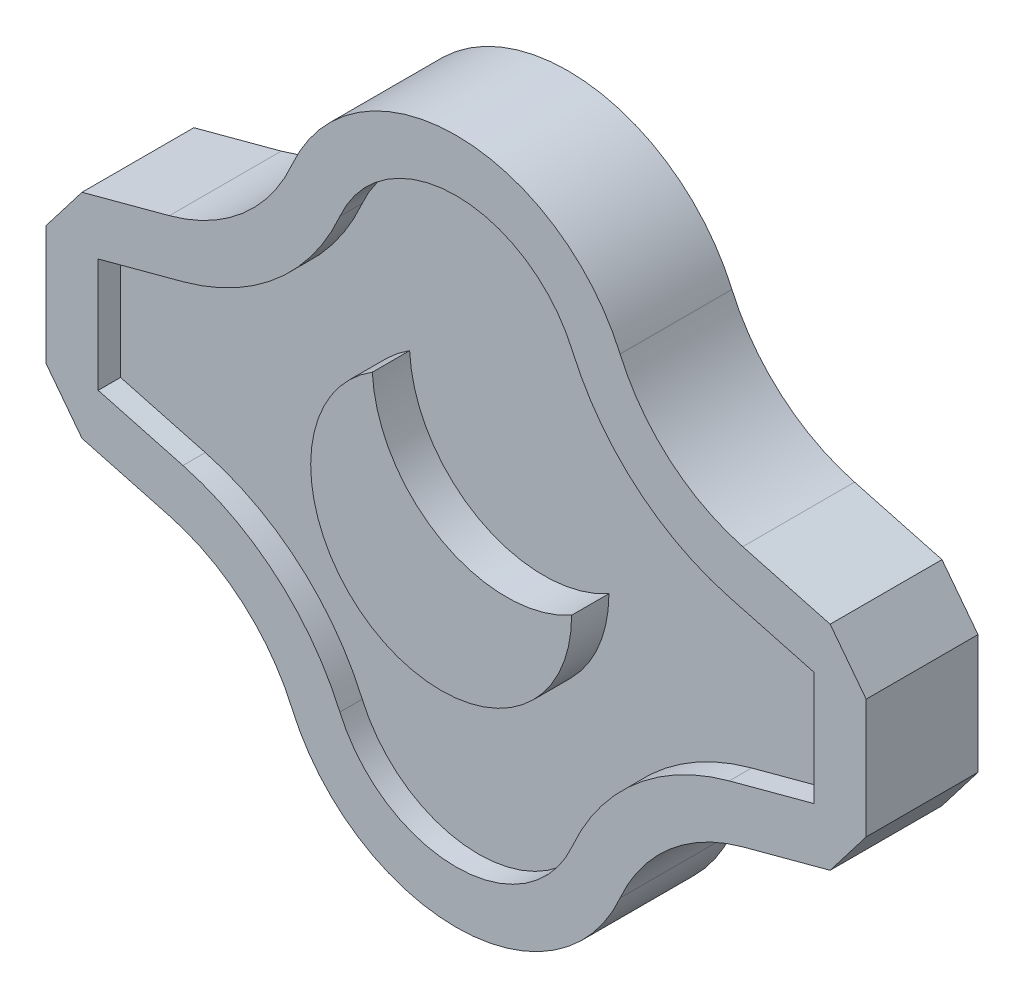
ISO-10303-21;
HEADER;
FILE_DESCRIPTION(('STEP AP214'),'2;1');
FILE_NAME('part.step','',(''),(''),'','','');
FILE_SCHEMA(('AUTOMOTIVE_DESIGN { 1 0 10303 214 1 1 1 1 }'));
ENDSEC;
DATA;
#1=APPLICATION_CONTEXT('core data for automotive mechanical design processes');
#2=APPLICATION_PROTOCOL_DEFINITION('international standard','automotive_design',2000,#1);
#3=PRODUCT_CONTEXT('',#1,'mechanical');
#4=PRODUCT('Part','Part','',(#3));
#5=PRODUCT_RELATED_PRODUCT_CATEGORY('part','',(#4));
#6=PRODUCT_DEFINITION_FORMATION('','',#4);
#7=PRODUCT_DEFINITION_CONTEXT('part definition',#1,'design');
#8=PRODUCT_DEFINITION('design','',#6,#7);
#9=PRODUCT_DEFINITION_SHAPE('','',#8);
#10=(LENGTH_UNIT() NAMED_UNIT(*) SI_UNIT(.MILLI.,.METRE.));
#11=(NAMED_UNIT(*) PLANE_ANGLE_UNIT() SI_UNIT($,.RADIAN.));
#12=(NAMED_UNIT(*) SI_UNIT($,.STERADIAN.) SOLID_ANGLE_UNIT());
#13=UNCERTAINTY_MEASURE_WITH_UNIT(LENGTH_MEASURE(1.E-05),#10,'distance_accuracy_value','');
#14=(GEOMETRIC_REPRESENTATION_CONTEXT(3) GLOBAL_UNCERTAINTY_ASSIGNED_CONTEXT((#13)) GLOBAL_UNIT_ASSIGNED_CONTEXT((#10,
#11,#12)) REPRESENTATION_CONTEXT('',''));
#15=CARTESIAN_POINT('',(0.,0.,0.));
#16=DIRECTION('',(0.,0.,1.));
#17=DIRECTION('',(1.,0.,0.));
#18=AXIS2_PLACEMENT_3D('',#15,#16,#17);
#19=CARTESIAN_POINT('',(44.916297988178,-41.5838243210359,0.));
#20=DIRECTION('',(0.,0.,1.));
#21=DIRECTION('',(1.,0.,0.));
#22=AXIS2_PLACEMENT_3D('',#19,#20,#21);
#23=PLANE('',#22);
#24=DIRECTION('',(0.965925826289068,-0.258819045102521,0.));
#25=VECTOR('',#24,1.);
#26=CARTESIAN_POINT('',(-55.,-13.,0.));
#27=LINE('',#26,#25);
#28=CARTESIAN_POINT('',(-50.1703708685546,-14.2940952255126,0.));
#29=VERTEX_POINT('',#28);
#30=CARTESIAN_POINT('',(-38.445821860615,-17.4356786638092,0.));
#31=VERTEX_POINT('',#30);
#32=EDGE_CURVE('E437',#29,#31,#27,.T.);
#33=ORIENTED_EDGE('',*,*,#32,.F.);
#34=DIRECTION('',(-0.608761429008719,0.793353340291236,0.));
#35=VECTOR('',#34,1.);
#36=CARTESIAN_POINT('',(-50.1703708685546,-14.2940952255126,0.));
#37=LINE('',#36,#35);
#38=CARTESIAN_POINT('',(-55.,-7.99999999999994,0.));
#39=VERTEX_POINT('',#38);
#40=EDGE_CURVE('E486',#29,#39,#37,.T.);
#41=ORIENTED_EDGE('',*,*,#40,.T.);
#42=DIRECTION('',(0.,1.,0.));
#43=VECTOR('',#42,1.);
#44=CARTESIAN_POINT('',(-55.,-13.,0.));
#45=LINE('',#44,#43);
#46=CARTESIAN_POINT('',(-55.,7.99999999999994,0.));
#47=VERTEX_POINT('',#46);
#48=EDGE_CURVE('E439',#39,#47,#45,.T.);
#49=ORIENTED_EDGE('',*,*,#48,.T.);
#50=DIRECTION('',(-0.60876142900872,-0.793353340291235,0.));
#51=VECTOR('',#50,1.);
#52=CARTESIAN_POINT('',(-55.,7.99999999999995,0.));
#53=LINE('',#52,#51);
#54=CARTESIAN_POINT('',(-50.1703708685546,14.2940952255126,0.));
#55=VERTEX_POINT('',#54);
#56=EDGE_CURVE('E484',#47,#55,#53,.F.);
#57=ORIENTED_EDGE('',*,*,#56,.T.);
#58=DIRECTION('',(0.965925826289068,0.258819045102521,0.));
#59=VECTOR('',#58,1.);
#60=CARTESIAN_POINT('',(-55.,13.,0.));
#61=LINE('',#60,#59);
#62=CARTESIAN_POINT('',(-38.445821860615,17.4356786638092,0.));
#63=VERTEX_POINT('',#62);
#64=EDGE_CURVE('E442',#55,#63,#61,.T.);
#65=ORIENTED_EDGE('',*,*,#64,.T.);
#66=CARTESIAN_POINT('',(-44.916297988178,41.5838243210359,0.));
#67=DIRECTION('',(0.,0.,1.));
#68=DIRECTION('',(1.,0.,0.));
#69=AXIS2_PLACEMENT_3D('',#66,#67,#68);
#70=CIRCLE('',#69,25.);
#71=CARTESIAN_POINT('',(-21.9998194227811,31.5920772184665,0.));
#72=VERTEX_POINT('',#71);
#73=EDGE_CURVE('E444',#63,#72,#70,.T.);
#74=ORIENTED_EDGE('',*,*,#73,.T.);
#75=CARTESIAN_POINT('',(0.,22.,0.));
#76=DIRECTION('',(0.,0.,-1.));
#77=DIRECTION('',(-1.,0.,0.));
#78=AXIS2_PLACEMENT_3D('',#75,#76,#77);
#79=CIRCLE('',#78,24.);
#80=CARTESIAN_POINT('',(21.9998194227811,31.5920772184665,0.));
#81=VERTEX_POINT('',#80);
#82=EDGE_CURVE('E447',#72,#81,#79,.T.);
#83=ORIENTED_EDGE('',*,*,#82,.T.);
#84=CARTESIAN_POINT('',(44.916297988178,41.5838243210359,0.));
#85=DIRECTION('',(0.,0.,-1.));
#86=DIRECTION('',(-1.,0.,0.));
#87=AXIS2_PLACEMENT_3D('',#84,#85,#86);
#88=CIRCLE('',#87,25.);
#89=CARTESIAN_POINT('',(38.445821860615,17.4356786638092,0.));
#90=VERTEX_POINT('',#89);
#91=EDGE_CURVE('E450',#90,#81,#88,.T.);
#92=ORIENTED_EDGE('',*,*,#91,.F.);
#93=DIRECTION('',(-0.965925826289068,0.258819045102521,0.));
#94=VECTOR('',#93,1.);
#95=CARTESIAN_POINT('',(55.,13.,0.));
#96=LINE('',#95,#94);
#97=CARTESIAN_POINT('',(50.1703708685546,14.2940952255126,0.));
#98=VERTEX_POINT('',#97);
#99=EDGE_CURVE('E453',#98,#90,#96,.T.);
#100=ORIENTED_EDGE('',*,*,#99,.F.);
#101=DIRECTION('',(-0.60876142900872,0.793353340291236,0.));
#102=VECTOR('',#101,1.);
#103=CARTESIAN_POINT('',(50.1703708685546,14.2940952255126,0.));
#104=LINE('',#103,#102);
#105=CARTESIAN_POINT('',(55.,7.99999999999994,0.));
#106=VERTEX_POINT('',#105);
#107=EDGE_CURVE('E480',#98,#106,#104,.F.);
#108=ORIENTED_EDGE('',*,*,#107,.T.);
#109=DIRECTION('',(0.,1.,0.));
#110=VECTOR('',#109,1.);
#111=CARTESIAN_POINT('',(55.,-13.,0.));
#112=LINE('',#111,#110);
#113=CARTESIAN_POINT('',(55.,-7.99999999999995,0.));
#114=VERTEX_POINT('',#113);
#115=EDGE_CURVE('E401',#114,#106,#112,.T.);
#116=ORIENTED_EDGE('',*,*,#115,.F.);
#117=DIRECTION('',(-0.60876142900872,-0.793353340291235,0.));
#118=VECTOR('',#117,1.);
#119=CARTESIAN_POINT('',(55.,-7.99999999999994,0.));
#120=LINE('',#119,#118);
#121=CARTESIAN_POINT('',(50.1703708685546,-14.2940952255126,0.));
#122=VERTEX_POINT('',#121);
#123=EDGE_CURVE('E482',#114,#122,#120,.T.);
#124=ORIENTED_EDGE('',*,*,#123,.T.);
#125=DIRECTION('',(-0.965925826289068,-0.258819045102521,0.));
#126=VECTOR('',#125,1.);
#127=CARTESIAN_POINT('',(55.,-13.,0.));
#128=LINE('',#127,#126);
#129=CARTESIAN_POINT('',(38.445821860615,-17.4356786638092,0.));
#130=VERTEX_POINT('',#129);
#131=EDGE_CURVE('E375',#122,#130,#128,.T.);
#132=ORIENTED_EDGE('',*,*,#131,.T.);
#133=CARTESIAN_POINT('',(44.916297988178,-41.5838243210359,0.));
#134=DIRECTION('',(0.,0.,1.));
#135=DIRECTION('',(1.,0.,0.));
#136=AXIS2_PLACEMENT_3D('',#133,#134,#135);
#137=CIRCLE('',#136,25.);
#138=CARTESIAN_POINT('',(21.9998194227811,-31.5920772184666,0.));
#139=VERTEX_POINT('',#138);
#140=EDGE_CURVE('E429',#130,#139,#137,.T.);
#141=ORIENTED_EDGE('',*,*,#140,.T.);
#142=CARTESIAN_POINT('',(0.,-22.,0.));
#143=DIRECTION('',(0.,0.,1.));
#144=DIRECTION('',(1.,0.,0.));
#145=AXIS2_PLACEMENT_3D('',#142,#143,#144);
#146=CIRCLE('',#145,24.);
#147=CARTESIAN_POINT('',(-21.9998194227811,-31.5920772184665,0.));
#148=VERTEX_POINT('',#147);
#149=EDGE_CURVE('E432',#148,#139,#146,.T.);
#150=ORIENTED_EDGE('',*,*,#149,.F.);
#151=CARTESIAN_POINT('',(-44.916297988178,-41.5838243210359,0.));
#152=DIRECTION('',(0.,0.,-1.));
#153=DIRECTION('',(-1.,0.,0.));
#154=AXIS2_PLACEMENT_3D('',#151,#152,#153);
#155=CIRCLE('',#154,25.);
#156=EDGE_CURVE('E435',#31,#148,#155,.T.);
#157=ORIENTED_EDGE('',*,*,#156,.F.);
#158=EDGE_LOOP('',(#33,#41,#49,#57,#65,#74,#83,#92,#100,#108,#116,#124,#132,#141,#150,#157));
#159=FACE_BOUND('',#158,.T.);
#160=CARTESIAN_POINT('',(8.75000000000001,15.7301462167394,0.));
#161=DIRECTION('',(0.,0.,-1.));
#162=DIRECTION('',(-1.,0.,0.));
#163=AXIS2_PLACEMENT_3D('',#160,#161,#162);
#164=CIRCLE('',#163,18.);
#165=CARTESIAN_POINT('',(17.5,0.,0.));
#166=VERTEX_POINT('',#165);
#167=CARTESIAN_POINT('',(-9.22935956790123,14.8683866631989,0.));
#168=VERTEX_POINT('',#167);
#169=EDGE_CURVE('E266',#166,#168,#164,.T.);
#170=ORIENTED_EDGE('',*,*,#169,.T.);
#171=CARTESIAN_POINT('',(0.,0.,0.));
#172=DIRECTION('',(0.,0.,-1.));
#173=DIRECTION('',(-1.,0.,0.));
#174=AXIS2_PLACEMENT_3D('',#171,#172,#173);
#175=CIRCLE('',#174,17.5);
#176=EDGE_CURVE('E277',#166,#168,#175,.T.);
#177=ORIENTED_EDGE('',*,*,#176,.F.);
#178=EDGE_LOOP('',(#170,#177));
#179=FACE_BOUND('',#178,.T.);
#180=ADVANCED_FACE('F49',(#159,#179),#23,.F.);
#181=CARTESIAN_POINT('',(44.916297988178,-41.5838243210359,12.));
#182=DIRECTION('',(0.,0.,1.));
#183=DIRECTION('',(1.,0.,0.));
#184=AXIS2_PLACEMENT_3D('',#181,#182,#183);
#185=PLANE('',#184);
#186=CARTESIAN_POINT('',(44.916297988178,-41.5838243210359,12.));
#187=DIRECTION('',(0.,0.,-1.));
#188=DIRECTION('',(1.,0.,0.));
#189=AXIS2_PLACEMENT_3D('',#186,#187,#188);
#190=CIRCLE('',#189,32.);
#191=CARTESIAN_POINT('',(15.5832054244699,-28.7943880297471,12.));
#192=VERTEX_POINT('',#191);
#193=CARTESIAN_POINT('',(36.6340885448973,-10.6741978797857,12.));
#194=VERTEX_POINT('',#193);
#195=EDGE_CURVE('E302',#192,#194,#190,.T.);
#196=ORIENTED_EDGE('',*,*,#195,.T.);
#197=DIRECTION('',(0.965925826289068,0.258819045102521,0.));
#198=VECTOR('',#197,1.);
#199=CARTESIAN_POINT('',(36.6340885448973,-10.6741978797857,12.));
#200=LINE('',#199,#198);
#201=CARTESIAN_POINT('',(48.,-7.62871108414727,12.));
#202=VERTEX_POINT('',#201);
#203=EDGE_CURVE('E305',#194,#202,#200,.T.);
#204=ORIENTED_EDGE('',*,*,#203,.T.);
#205=DIRECTION('',(0.,1.,0.));
#206=VECTOR('',#205,1.);
#207=CARTESIAN_POINT('',(48.,-7.62871108414727,12.));
#208=LINE('',#207,#206);
#209=CARTESIAN_POINT('',(48.,7.62871108414727,12.));
#210=VERTEX_POINT('',#209);
#211=EDGE_CURVE('E309',#202,#210,#208,.T.);
#212=ORIENTED_EDGE('',*,*,#211,.T.);
#213=DIRECTION('',(-0.965925826289068,0.258819045102521,0.));
#214=VECTOR('',#213,1.);
#215=CARTESIAN_POINT('',(48.,7.62871108414727,12.));
#216=LINE('',#215,#214);
#217=CARTESIAN_POINT('',(36.6340885448973,10.6741978797857,12.));
#218=VERTEX_POINT('',#217);
#219=EDGE_CURVE('E312',#210,#218,#216,.T.);
#220=ORIENTED_EDGE('',*,*,#219,.T.);
#221=CARTESIAN_POINT('',(44.916297988178,41.5838243210359,12.));
#222=DIRECTION('',(0.,0.,-1.));
#223=DIRECTION('',(1.,0.,0.));
#224=AXIS2_PLACEMENT_3D('',#221,#222,#223);
#225=CIRCLE('',#224,32.);
#226=CARTESIAN_POINT('',(15.5832054244699,28.7943880297471,12.));
#227=VERTEX_POINT('',#226);
#228=EDGE_CURVE('E315',#218,#227,#225,.T.);
#229=ORIENTED_EDGE('',*,*,#228,.T.);
#230=CARTESIAN_POINT('',(0.,22.,12.));
#231=DIRECTION('',(0.,0.,1.));
#232=DIRECTION('',(1.,0.,0.));
#233=AXIS2_PLACEMENT_3D('',#230,#231,#232);
#234=CIRCLE('',#233,17.);
#235=CARTESIAN_POINT('',(-15.5832054244699,28.7943880297471,12.));
#236=VERTEX_POINT('',#235);
#237=EDGE_CURVE('E318',#227,#236,#234,.T.);
#238=ORIENTED_EDGE('',*,*,#237,.T.);
#239=CARTESIAN_POINT('',(-44.916297988178,41.5838243210359,12.));
#240=DIRECTION('',(0.,0.,-1.));
#241=DIRECTION('',(1.,0.,0.));
#242=AXIS2_PLACEMENT_3D('',#239,#240,#241);
#243=CIRCLE('',#242,32.);
#244=CARTESIAN_POINT('',(-36.6340885448973,10.6741978797857,12.));
#245=VERTEX_POINT('',#244);
#246=EDGE_CURVE('E321',#236,#245,#243,.T.);
#247=ORIENTED_EDGE('',*,*,#246,.T.);
#248=DIRECTION('',(-0.965925826289068,-0.258819045102522,0.));
#249=VECTOR('',#248,1.);
#250=CARTESIAN_POINT('',(-36.6340885448973,10.6741978797857,12.));
#251=LINE('',#250,#249);
#252=CARTESIAN_POINT('',(-48.,7.62871108414727,12.));
#253=VERTEX_POINT('',#252);
#254=EDGE_CURVE('E324',#245,#253,#251,.T.);
#255=ORIENTED_EDGE('',*,*,#254,.T.);
#256=DIRECTION('',(0.,-1.,0.));
#257=VECTOR('',#256,1.);
#258=CARTESIAN_POINT('',(-48.,7.62871108414727,12.));
#259=LINE('',#258,#257);
#260=CARTESIAN_POINT('',(-48.,-7.62871108414727,12.));
#261=VERTEX_POINT('',#260);
#262=EDGE_CURVE('E327',#253,#261,#259,.T.);
#263=ORIENTED_EDGE('',*,*,#262,.T.);
#264=DIRECTION('',(0.965925826289068,-0.258819045102521,0.));
#265=VECTOR('',#264,1.);
#266=CARTESIAN_POINT('',(-48.,-7.62871108414727,12.));
#267=LINE('',#266,#265);
#268=CARTESIAN_POINT('',(-36.6340885448973,-10.6741978797857,12.));
#269=VERTEX_POINT('',#268);
#270=EDGE_CURVE('E330',#261,#269,#267,.T.);
#271=ORIENTED_EDGE('',*,*,#270,.T.);
#272=CARTESIAN_POINT('',(-44.916297988178,-41.5838243210359,12.));
#273=DIRECTION('',(0.,0.,-1.));
#274=DIRECTION('',(1.,0.,0.));
#275=AXIS2_PLACEMENT_3D('',#272,#273,#274);
#276=CIRCLE('',#275,32.);
#277=CARTESIAN_POINT('',(-15.5832054244699,-28.7943880297471,12.));
#278=VERTEX_POINT('',#277);
#279=EDGE_CURVE('E333',#269,#278,#276,.T.);
#280=ORIENTED_EDGE('',*,*,#279,.T.);
#281=CARTESIAN_POINT('',(0.,-22.,12.));
#282=DIRECTION('',(0.,0.,1.));
#283=DIRECTION('',(1.,0.,0.));
#284=AXIS2_PLACEMENT_3D('',#281,#282,#283);
#285=CIRCLE('',#284,17.);
#286=EDGE_CURVE('E336',#278,#192,#285,.T.);
#287=ORIENTED_EDGE('',*,*,#286,.T.);
#288=EDGE_LOOP('',(#196,#204,#212,#220,#229,#238,#247,#255,#263,#271,#280,#287));
#289=FACE_BOUND('',#288,.T.);
#290=CARTESIAN_POINT('',(8.75000000000001,15.7301462167394,12.));
#291=DIRECTION('',(0.,0.,1.));
#292=DIRECTION('',(1.,0.,0.));
#293=AXIS2_PLACEMENT_3D('',#290,#291,#292);
#294=CIRCLE('',#293,18.);
#295=CARTESIAN_POINT('',(-9.22935956790123,14.8683866631989,12.));
#296=VERTEX_POINT('',#295);
#297=CARTESIAN_POINT('',(17.5,0.,12.));
#298=VERTEX_POINT('',#297);
#299=EDGE_CURVE('E284',#296,#298,#294,.T.);
#300=ORIENTED_EDGE('',*,*,#299,.T.);
#301=CARTESIAN_POINT('',(0.,0.,12.));
#302=DIRECTION('',(0.,0.,1.));
#303=DIRECTION('',(1.,0.,0.));
#304=AXIS2_PLACEMENT_3D('',#301,#302,#303);
#305=CIRCLE('',#304,17.5);
#306=EDGE_CURVE('E290',#296,#298,#305,.T.);
#307=ORIENTED_EDGE('',*,*,#306,.F.);
#308=EDGE_LOOP('',(#300,#307));
#309=FACE_BOUND('',#308,.T.);
#310=ADVANCED_FACE('F588',(#289,#309),#185,.T.);
#311=CARTESIAN_POINT('',(55.,-13.,15.));
#312=DIRECTION('',(0.258819045102521,-0.965925826289068,0.));
#313=DIRECTION('',(0.965925826289068,0.258819045102521,0.));
#314=AXIS2_PLACEMENT_3D('',#311,#312,#313);
#315=PLANE('',#314);
#316=ORIENTED_EDGE('',*,*,#131,.F.);
#317=DIRECTION('',(0.,0.,1.));
#318=VECTOR('',#317,1.);
#319=CARTESIAN_POINT('',(50.1703708685546,-14.2940952255126,15.));
#320=LINE('',#319,#318);
#321=CARTESIAN_POINT('',(50.1703708685546,-14.2940952255126,15.));
#322=VERTEX_POINT('',#321);
#323=EDGE_CURVE('E58',#122,#322,#320,.T.);
#324=ORIENTED_EDGE('',*,*,#323,.T.);
#325=DIRECTION('',(-0.965925826289068,-0.258819045102521,0.));
#326=VECTOR('',#325,1.);
#327=CARTESIAN_POINT('',(55.,-13.,15.));
#328=LINE('',#327,#326);
#329=CARTESIAN_POINT('',(38.445821860615,-17.4356786638092,15.));
#330=VERTEX_POINT('',#329);
#331=EDGE_CURVE('E398',#322,#330,#328,.T.);
#332=ORIENTED_EDGE('',*,*,#331,.T.);
#333=DIRECTION('',(0.,0.,-1.));
#334=VECTOR('',#333,1.);
#335=CARTESIAN_POINT('',(38.445821860615,-17.4356786638092,15.));
#336=LINE('',#335,#334);
#337=EDGE_CURVE('E427',#330,#130,#336,.T.);
#338=ORIENTED_EDGE('',*,*,#337,.T.);
#339=EDGE_LOOP('',(#316,#324,#332,#338));
#340=FACE_BOUND('',#339,.T.);
#341=ADVANCED_FACE('F509',(#340),#315,.T.);
#342=CARTESIAN_POINT('',(55.,-13.,15.));
#343=DIRECTION('',(-1.,0.,0.));
#344=DIRECTION('',(0.,0.,1.));
#345=AXIS2_PLACEMENT_3D('',#342,#343,#344);
#346=PLANE('',#345);
#347=DIRECTION('',(0.,1.,0.));
#348=VECTOR('',#347,1.);
#349=CARTESIAN_POINT('',(55.,-13.,15.));
#350=LINE('',#349,#348);
#351=CARTESIAN_POINT('',(55.,-7.99999999999995,15.));
#352=VERTEX_POINT('',#351);
#353=CARTESIAN_POINT('',(55.,7.99999999999994,15.));
#354=VERTEX_POINT('',#353);
#355=EDGE_CURVE('E425',#352,#354,#350,.T.);
#356=ORIENTED_EDGE('',*,*,#355,.F.);
#357=DIRECTION('',(0.,0.,-1.));
#358=VECTOR('',#357,1.);
#359=CARTESIAN_POINT('',(55.,-7.99999999999994,0.));
#360=LINE('',#359,#358);
#361=EDGE_CURVE('E503',#352,#114,#360,.T.);
#362=ORIENTED_EDGE('',*,*,#361,.T.);
#363=ORIENTED_EDGE('',*,*,#115,.T.);
#364=DIRECTION('',(0.,0.,1.));
#365=VECTOR('',#364,1.);
#366=CARTESIAN_POINT('',(55.,7.99999999999995,15.));
#367=LINE('',#366,#365);
#368=EDGE_CURVE('E501',#106,#354,#367,.T.);
#369=ORIENTED_EDGE('',*,*,#368,.T.);
#370=EDGE_LOOP('',(#356,#362,#363,#369));
#371=FACE_BOUND('',#370,.T.);
#372=ADVANCED_FACE('F521',(#371),#346,.F.);
#373=CARTESIAN_POINT('',(55.,13.,15.));
#374=DIRECTION('',(-0.258819045102521,-0.965925826289068,0.));
#375=DIRECTION('',(0.965925826289068,-0.258819045102521,0.));
#376=AXIS2_PLACEMENT_3D('',#373,#374,#375);
#377=PLANE('',#376);
#378=DIRECTION('',(-0.965925826289068,0.258819045102521,0.));
#379=VECTOR('',#378,1.);
#380=CARTESIAN_POINT('',(55.,13.,15.));
#381=LINE('',#380,#379);
#382=CARTESIAN_POINT('',(50.1703708685546,14.2940952255126,15.));
#383=VERTEX_POINT('',#382);
#384=CARTESIAN_POINT('',(38.445821860615,17.4356786638092,15.));
#385=VERTEX_POINT('',#384);
#386=EDGE_CURVE('E423',#383,#385,#381,.T.);
#387=ORIENTED_EDGE('',*,*,#386,.F.);
#388=DIRECTION('',(0.,0.,-1.));
#389=VECTOR('',#388,1.);
#390=CARTESIAN_POINT('',(50.1703708685546,14.2940952255126,15.));
#391=LINE('',#390,#389);
#392=EDGE_CURVE('E11',#383,#98,#391,.T.);
#393=ORIENTED_EDGE('',*,*,#392,.T.);
#394=ORIENTED_EDGE('',*,*,#99,.T.);
#395=DIRECTION('',(0.,0.,-1.));
#396=VECTOR('',#395,1.);
#397=CARTESIAN_POINT('',(38.445821860615,17.4356786638092,15.));
#398=LINE('',#397,#396);
#399=EDGE_CURVE('E457',#385,#90,#398,.T.);
#400=ORIENTED_EDGE('',*,*,#399,.F.);
#401=EDGE_LOOP('',(#387,#393,#394,#400));
#402=FACE_BOUND('',#401,.T.);
#403=ADVANCED_FACE('F531',(#402),#377,.F.);
#404=CARTESIAN_POINT('',(44.916297988178,41.5838243210359,15.));
#405=DIRECTION('',(0.,0.,-1.));
#406=DIRECTION('',(-1.,0.,0.));
#407=AXIS2_PLACEMENT_3D('',#404,#405,#406);
#408=CYLINDRICAL_SURFACE('',#407,25.);
#409=ORIENTED_EDGE('',*,*,#91,.T.);
#410=DIRECTION('',(0.,0.,-1.));
#411=VECTOR('',#410,1.);
#412=CARTESIAN_POINT('',(21.9998194227811,31.5920772184665,15.));
#413=LINE('',#412,#411);
#414=CARTESIAN_POINT('',(21.9998194227811,31.5920772184665,15.));
#415=VERTEX_POINT('',#414);
#416=EDGE_CURVE('E461',#415,#81,#413,.T.);
#417=ORIENTED_EDGE('',*,*,#416,.F.);
#418=CARTESIAN_POINT('',(44.916297988178,41.5838243210359,15.));
#419=DIRECTION('',(0.,0.,-1.));
#420=DIRECTION('',(-1.,0.,0.));
#421=AXIS2_PLACEMENT_3D('',#418,#419,#420);
#422=CIRCLE('',#421,25.);
#423=EDGE_CURVE('E421',#385,#415,#422,.T.);
#424=ORIENTED_EDGE('',*,*,#423,.F.);
#425=ORIENTED_EDGE('',*,*,#399,.T.);
#426=EDGE_LOOP('',(#409,#417,#424,#425));
#427=FACE_BOUND('',#426,.T.);
#428=ADVANCED_FACE('F538',(#427),#408,.F.);
#429=CARTESIAN_POINT('',(0.,22.,15.));
#430=DIRECTION('',(0.,0.,-1.));
#431=DIRECTION('',(-1.,0.,0.));
#432=AXIS2_PLACEMENT_3D('',#429,#430,#431);
#433=CYLINDRICAL_SURFACE('',#432,24.);
#434=ORIENTED_EDGE('',*,*,#82,.F.);
#435=DIRECTION('',(0.,0.,-1.));
#436=VECTOR('',#435,1.);
#437=CARTESIAN_POINT('',(-21.9998194227811,31.5920772184665,15.));
#438=LINE('',#437,#436);
#439=CARTESIAN_POINT('',(-21.9998194227811,31.5920772184665,15.));
#440=VERTEX_POINT('',#439);
#441=EDGE_CURVE('E463',#440,#72,#438,.T.);
#442=ORIENTED_EDGE('',*,*,#441,.F.);
#443=CARTESIAN_POINT('',(0.,22.,15.));
#444=DIRECTION('',(0.,0.,-1.));
#445=DIRECTION('',(-1.,0.,0.));
#446=AXIS2_PLACEMENT_3D('',#443,#444,#445);
#447=CIRCLE('',#446,24.);
#448=EDGE_CURVE('E418',#440,#415,#447,.T.);
#449=ORIENTED_EDGE('',*,*,#448,.T.);
#450=ORIENTED_EDGE('',*,*,#416,.T.);
#451=EDGE_LOOP('',(#434,#442,#449,#450));
#452=FACE_BOUND('',#451,.T.);
#453=ADVANCED_FACE('F541',(#452),#433,.T.);
#454=CARTESIAN_POINT('',(-44.916297988178,41.5838243210359,15.));
#455=DIRECTION('',(0.,0.,-1.));
#456=DIRECTION('',(-1.,0.,0.));
#457=AXIS2_PLACEMENT_3D('',#454,#455,#456);
#458=CYLINDRICAL_SURFACE('',#457,25.);
#459=ORIENTED_EDGE('',*,*,#73,.F.);
#460=DIRECTION('',(0.,0.,-1.));
#461=VECTOR('',#460,1.);
#462=CARTESIAN_POINT('',(-38.445821860615,17.4356786638092,15.));
#463=LINE('',#462,#461);
#464=CARTESIAN_POINT('',(-38.445821860615,17.4356786638092,15.));
#465=VERTEX_POINT('',#464);
#466=EDGE_CURVE('E465',#465,#63,#463,.T.);
#467=ORIENTED_EDGE('',*,*,#466,.F.);
#468=CARTESIAN_POINT('',(-44.916297988178,41.5838243210359,15.));
#469=DIRECTION('',(0.,0.,1.));
#470=DIRECTION('',(1.,0.,0.));
#471=AXIS2_PLACEMENT_3D('',#468,#469,#470);
#472=CIRCLE('',#471,25.);
#473=EDGE_CURVE('E415',#465,#440,#472,.T.);
#474=ORIENTED_EDGE('',*,*,#473,.T.);
#475=ORIENTED_EDGE('',*,*,#441,.T.);
#476=EDGE_LOOP('',(#459,#467,#474,#475));
#477=FACE_BOUND('',#476,.T.);
#478=ADVANCED_FACE('F544',(#477),#458,.F.);
#479=CARTESIAN_POINT('',(-55.,13.,15.));
#480=DIRECTION('',(-0.258819045102521,0.965925826289068,0.));
#481=DIRECTION('',(-0.965925826289068,-0.258819045102521,0.));
#482=AXIS2_PLACEMENT_3D('',#479,#480,#481);
#483=PLANE('',#482);
#484=ORIENTED_EDGE('',*,*,#64,.F.);
#485=DIRECTION('',(0.,0.,1.));
#486=VECTOR('',#485,1.);
#487=CARTESIAN_POINT('',(-50.1703708685546,14.2940952255126,15.));
#488=LINE('',#487,#486);
#489=CARTESIAN_POINT('',(-50.1703708685546,14.2940952255126,15.));
#490=VERTEX_POINT('',#489);
#491=EDGE_CURVE('E65',#55,#490,#488,.T.);
#492=ORIENTED_EDGE('',*,*,#491,.T.);
#493=DIRECTION('',(0.965925826289068,0.258819045102521,0.));
#494=VECTOR('',#493,1.);
#495=CARTESIAN_POINT('',(-55.,13.,15.));
#496=LINE('',#495,#494);
#497=EDGE_CURVE('E413',#490,#465,#496,.T.);
#498=ORIENTED_EDGE('',*,*,#497,.T.);
#499=ORIENTED_EDGE('',*,*,#466,.T.);
#500=EDGE_LOOP('',(#484,#492,#498,#499));
#501=FACE_BOUND('',#500,.T.);
#502=ADVANCED_FACE('F609',(#501),#483,.T.);
#503=CARTESIAN_POINT('',(-55.,-13.,15.));
#504=DIRECTION('',(-1.,0.,0.));
#505=DIRECTION('',(0.,0.,1.));
#506=AXIS2_PLACEMENT_3D('',#503,#504,#505);
#507=PLANE('',#506);
#508=ORIENTED_EDGE('',*,*,#48,.F.);
#509=DIRECTION('',(0.,0.,1.));
#510=VECTOR('',#509,1.);
#511=CARTESIAN_POINT('',(-55.,-7.99999999999994,15.));
#512=LINE('',#511,#510);
#513=CARTESIAN_POINT('',(-55.,-7.99999999999994,15.));
#514=VERTEX_POINT('',#513);
#515=EDGE_CURVE('E491',#39,#514,#512,.T.);
#516=ORIENTED_EDGE('',*,*,#515,.T.);
#517=DIRECTION('',(0.,1.,0.));
#518=VECTOR('',#517,1.);
#519=CARTESIAN_POINT('',(-55.,-13.,15.));
#520=LINE('',#519,#518);
#521=CARTESIAN_POINT('',(-55.,7.99999999999994,15.));
#522=VERTEX_POINT('',#521);
#523=EDGE_CURVE('E410',#514,#522,#520,.T.);
#524=ORIENTED_EDGE('',*,*,#523,.T.);
#525=DIRECTION('',(0.,0.,-1.));
#526=VECTOR('',#525,1.);
#527=CARTESIAN_POINT('',(-55.,7.99999999999995,15.));
#528=LINE('',#527,#526);
#529=EDGE_CURVE('E488',#522,#47,#528,.T.);
#530=ORIENTED_EDGE('',*,*,#529,.T.);
#531=EDGE_LOOP('',(#508,#516,#524,#530));
#532=FACE_BOUND('',#531,.T.);
#533=ADVANCED_FACE('F552',(#532),#507,.T.);
#534=CARTESIAN_POINT('',(-55.,-13.,15.));
#535=DIRECTION('',(0.258819045102521,0.965925826289068,0.));
#536=DIRECTION('',(-0.965925826289068,0.258819045102521,0.));
#537=AXIS2_PLACEMENT_3D('',#534,#535,#536);
#538=PLANE('',#537);
#539=DIRECTION('',(0.965925826289068,-0.258819045102521,0.));
#540=VECTOR('',#539,1.);
#541=CARTESIAN_POINT('',(-55.,-13.,15.));
#542=LINE('',#541,#540);
#543=CARTESIAN_POINT('',(-50.1703708685546,-14.2940952255126,15.));
#544=VERTEX_POINT('',#543);
#545=CARTESIAN_POINT('',(-38.445821860615,-17.4356786638092,15.));
#546=VERTEX_POINT('',#545);
#547=EDGE_CURVE('E408',#544,#546,#542,.T.);
#548=ORIENTED_EDGE('',*,*,#547,.F.);
#549=DIRECTION('',(0.,0.,-1.));
#550=VECTOR('',#549,1.);
#551=CARTESIAN_POINT('',(-50.1703708685546,-14.2940952255126,0.));
#552=LINE('',#551,#550);
#553=EDGE_CURVE('E460',#544,#29,#552,.T.);
#554=ORIENTED_EDGE('',*,*,#553,.T.);
#555=ORIENTED_EDGE('',*,*,#32,.T.);
#556=DIRECTION('',(0.,0.,-1.));
#557=VECTOR('',#556,1.);
#558=CARTESIAN_POINT('',(-38.445821860615,-17.4356786638092,15.));
#559=LINE('',#558,#557);
#560=EDGE_CURVE('E468',#546,#31,#559,.T.);
#561=ORIENTED_EDGE('',*,*,#560,.F.);
#562=EDGE_LOOP('',(#548,#554,#555,#561));
#563=FACE_BOUND('',#562,.T.);
#564=ADVANCED_FACE('F561',(#563),#538,.F.);
#565=CARTESIAN_POINT('',(-44.916297988178,-41.5838243210359,15.));
#566=DIRECTION('',(0.,0.,-1.));
#567=DIRECTION('',(-1.,0.,0.));
#568=AXIS2_PLACEMENT_3D('',#565,#566,#567);
#569=CYLINDRICAL_SURFACE('',#568,25.);
#570=ORIENTED_EDGE('',*,*,#156,.T.);
#571=DIRECTION('',(0.,0.,-1.));
#572=VECTOR('',#571,1.);
#573=CARTESIAN_POINT('',(-21.9998194227811,-31.5920772184665,15.));
#574=LINE('',#573,#572);
#575=CARTESIAN_POINT('',(-21.9998194227811,-31.5920772184665,15.));
#576=VERTEX_POINT('',#575);
#577=EDGE_CURVE('E471',#576,#148,#574,.T.);
#578=ORIENTED_EDGE('',*,*,#577,.F.);
#579=CARTESIAN_POINT('',(-44.916297988178,-41.5838243210359,15.));
#580=DIRECTION('',(0.,0.,-1.));
#581=DIRECTION('',(-1.,0.,0.));
#582=AXIS2_PLACEMENT_3D('',#579,#580,#581);
#583=CIRCLE('',#582,25.);
#584=EDGE_CURVE('E406',#546,#576,#583,.T.);
#585=ORIENTED_EDGE('',*,*,#584,.F.);
#586=ORIENTED_EDGE('',*,*,#560,.T.);
#587=EDGE_LOOP('',(#570,#578,#585,#586));
#588=FACE_BOUND('',#587,.T.);
#589=ADVANCED_FACE('F568',(#588),#569,.F.);
#590=CARTESIAN_POINT('',(0.,-22.,15.));
#591=DIRECTION('',(0.,0.,-1.));
#592=DIRECTION('',(-1.,0.,0.));
#593=AXIS2_PLACEMENT_3D('',#590,#591,#592);
#594=CYLINDRICAL_SURFACE('',#593,24.);
#595=ORIENTED_EDGE('',*,*,#149,.T.);
#596=DIRECTION('',(0.,0.,-1.));
#597=VECTOR('',#596,1.);
#598=CARTESIAN_POINT('',(21.9998194227811,-31.5920772184666,15.));
#599=LINE('',#598,#597);
#600=CARTESIAN_POINT('',(21.9998194227811,-31.5920772184666,15.));
#601=VERTEX_POINT('',#600);
#602=EDGE_CURVE('E474',#601,#139,#599,.T.);
#603=ORIENTED_EDGE('',*,*,#602,.F.);
#604=CARTESIAN_POINT('',(0.,-22.,15.));
#605=DIRECTION('',(0.,0.,1.));
#606=DIRECTION('',(1.,0.,0.));
#607=AXIS2_PLACEMENT_3D('',#604,#605,#606);
#608=CIRCLE('',#607,24.);
#609=EDGE_CURVE('E404',#576,#601,#608,.T.);
#610=ORIENTED_EDGE('',*,*,#609,.F.);
#611=ORIENTED_EDGE('',*,*,#577,.T.);
#612=EDGE_LOOP('',(#595,#603,#610,#611));
#613=FACE_BOUND('',#612,.T.);
#614=ADVANCED_FACE('F571',(#613),#594,.T.);
#615=CARTESIAN_POINT('',(44.916297988178,-41.5838243210359,15.));
#616=DIRECTION('',(0.,0.,-1.));
#617=DIRECTION('',(-1.,0.,0.));
#618=AXIS2_PLACEMENT_3D('',#615,#616,#617);
#619=CYLINDRICAL_SURFACE('',#618,25.);
#620=ORIENTED_EDGE('',*,*,#140,.F.);
#621=ORIENTED_EDGE('',*,*,#337,.F.);
#622=CARTESIAN_POINT('',(44.916297988178,-41.5838243210359,15.));
#623=DIRECTION('',(0.,0.,1.));
#624=DIRECTION('',(1.,0.,0.));
#625=AXIS2_PLACEMENT_3D('',#622,#623,#624);
#626=CIRCLE('',#625,25.);
#627=EDGE_CURVE('E400',#330,#601,#626,.T.);
#628=ORIENTED_EDGE('',*,*,#627,.T.);
#629=ORIENTED_EDGE('',*,*,#602,.T.);
#630=EDGE_LOOP('',(#620,#621,#628,#629));
#631=FACE_BOUND('',#630,.T.);
#632=ADVANCED_FACE('F574',(#631),#619,.F.);
#633=CARTESIAN_POINT('',(44.916297988178,-41.5838243210359,15.));
#634=DIRECTION('',(0.,0.,1.));
#635=DIRECTION('',(1.,0.,0.));
#636=AXIS2_PLACEMENT_3D('',#633,#634,#635);
#637=PLANE('',#636);
#638=CARTESIAN_POINT('',(44.916297988178,-41.5838243210359,15.));
#639=DIRECTION('',(0.,0.,-1.));
#640=DIRECTION('',(1.,0.,0.));
#641=AXIS2_PLACEMENT_3D('',#638,#639,#640);
#642=CIRCLE('',#641,32.);
#643=CARTESIAN_POINT('',(15.5832054244699,-28.7943880297471,15.));
#644=VERTEX_POINT('',#643);
#645=CARTESIAN_POINT('',(36.6340885448973,-10.6741978797857,15.));
#646=VERTEX_POINT('',#645);
#647=EDGE_CURVE('E301',#644,#646,#642,.T.);
#648=ORIENTED_EDGE('',*,*,#647,.F.);
#649=CARTESIAN_POINT('',(0.,-22.,15.));
#650=DIRECTION('',(0.,0.,1.));
#651=DIRECTION('',(1.,0.,0.));
#652=AXIS2_PLACEMENT_3D('',#649,#650,#651);
#653=CIRCLE('',#652,17.);
#654=CARTESIAN_POINT('',(-15.5832054244699,-28.7943880297471,15.));
#655=VERTEX_POINT('',#654);
#656=EDGE_CURVE('E306',#655,#644,#653,.T.);
#657=ORIENTED_EDGE('',*,*,#656,.F.);
#658=CARTESIAN_POINT('',(-44.916297988178,-41.5838243210359,15.));
#659=DIRECTION('',(0.,0.,-1.));
#660=DIRECTION('',(1.,0.,0.));
#661=AXIS2_PLACEMENT_3D('',#658,#659,#660);
#662=CIRCLE('',#661,32.);
#663=CARTESIAN_POINT('',(-36.6340885448973,-10.6741978797857,15.));
#664=VERTEX_POINT('',#663);
#665=EDGE_CURVE('E368',#664,#655,#662,.T.);
#666=ORIENTED_EDGE('',*,*,#665,.F.);
#667=DIRECTION('',(0.965925826289068,-0.258819045102521,0.));
#668=VECTOR('',#667,1.);
#669=CARTESIAN_POINT('',(-48.,-7.62871108414727,15.));
#670=LINE('',#669,#668);
#671=CARTESIAN_POINT('',(-48.,-7.62871108414727,15.));
#672=VERTEX_POINT('',#671);
#673=EDGE_CURVE('E365',#672,#664,#670,.T.);
#674=ORIENTED_EDGE('',*,*,#673,.F.);
#675=DIRECTION('',(0.,-1.,0.));
#676=VECTOR('',#675,1.);
#677=CARTESIAN_POINT('',(-48.,7.62871108414727,15.));
#678=LINE('',#677,#676);
#679=CARTESIAN_POINT('',(-48.,7.62871108414727,15.));
#680=VERTEX_POINT('',#679);
#681=EDGE_CURVE('E362',#680,#672,#678,.T.);
#682=ORIENTED_EDGE('',*,*,#681,.F.);
#683=DIRECTION('',(-0.965925826289068,-0.258819045102522,0.));
#684=VECTOR('',#683,1.);
#685=CARTESIAN_POINT('',(-36.6340885448973,10.6741978797857,15.));
#686=LINE('',#685,#684);
#687=CARTESIAN_POINT('',(-36.6340885448973,10.6741978797857,15.));
#688=VERTEX_POINT('',#687);
#689=EDGE_CURVE('E359',#688,#680,#686,.T.);
#690=ORIENTED_EDGE('',*,*,#689,.F.);
#691=CARTESIAN_POINT('',(-44.916297988178,41.5838243210359,15.));
#692=DIRECTION('',(0.,0.,-1.));
#693=DIRECTION('',(1.,0.,0.));
#694=AXIS2_PLACEMENT_3D('',#691,#692,#693);
#695=CIRCLE('',#694,32.);
#696=CARTESIAN_POINT('',(-15.5832054244699,28.7943880297471,15.));
#697=VERTEX_POINT('',#696);
#698=EDGE_CURVE('E356',#697,#688,#695,.T.);
#699=ORIENTED_EDGE('',*,*,#698,.F.);
#700=CARTESIAN_POINT('',(0.,22.,15.));
#701=DIRECTION('',(0.,0.,1.));
#702=DIRECTION('',(1.,0.,0.));
#703=AXIS2_PLACEMENT_3D('',#700,#701,#702);
#704=CIRCLE('',#703,17.);
#705=CARTESIAN_POINT('',(15.5832054244699,28.7943880297471,15.));
#706=VERTEX_POINT('',#705);
#707=EDGE_CURVE('E353',#706,#697,#704,.T.);
#708=ORIENTED_EDGE('',*,*,#707,.F.);
#709=CARTESIAN_POINT('',(44.916297988178,41.5838243210359,15.));
#710=DIRECTION('',(0.,0.,-1.));
#711=DIRECTION('',(1.,0.,0.));
#712=AXIS2_PLACEMENT_3D('',#709,#710,#711);
#713=CIRCLE('',#712,32.);
#714=CARTESIAN_POINT('',(36.6340885448973,10.6741978797857,15.));
#715=VERTEX_POINT('',#714);
#716=EDGE_CURVE('E350',#715,#706,#713,.T.);
#717=ORIENTED_EDGE('',*,*,#716,.F.);
#718=DIRECTION('',(-0.965925826289068,0.258819045102521,0.));
#719=VECTOR('',#718,1.);
#720=CARTESIAN_POINT('',(48.,7.62871108414727,15.));
#721=LINE('',#720,#719);
#722=CARTESIAN_POINT('',(48.,7.62871108414727,15.));
#723=VERTEX_POINT('',#722);
#724=EDGE_CURVE('E347',#723,#715,#721,.T.);
#725=ORIENTED_EDGE('',*,*,#724,.F.);
#726=DIRECTION('',(0.,1.,0.));
#727=VECTOR('',#726,1.);
#728=CARTESIAN_POINT('',(48.,-7.62871108414727,15.));
#729=LINE('',#728,#727);
#730=CARTESIAN_POINT('',(48.,-7.62871108414727,15.));
#731=VERTEX_POINT('',#730);
#732=EDGE_CURVE('E344',#731,#723,#729,.T.);
#733=ORIENTED_EDGE('',*,*,#732,.F.);
#734=DIRECTION('',(0.965925826289068,0.258819045102521,0.));
#735=VECTOR('',#734,1.);
#736=CARTESIAN_POINT('',(36.6340885448973,-10.6741978797857,15.));
#737=LINE('',#736,#735);
#738=EDGE_CURVE('E341',#646,#731,#737,.T.);
#739=ORIENTED_EDGE('',*,*,#738,.F.);
#740=EDGE_LOOP('',(#648,#657,#666,#674,#682,#690,#699,#708,#717,#725,#733,#739));
#741=FACE_BOUND('',#740,.T.);
#742=ORIENTED_EDGE('',*,*,#523,.F.);
#743=DIRECTION('',(0.608761429008719,-0.793353340291236,0.));
#744=VECTOR('',#743,1.);
#745=CARTESIAN_POINT('',(-1.75222979502899,-77.3938451783364,15.));
#746=LINE('',#745,#744);
#747=EDGE_CURVE('E498',#514,#544,#746,.T.);
#748=ORIENTED_EDGE('',*,*,#747,.T.);
#749=ORIENTED_EDGE('',*,*,#547,.T.);
#750=ORIENTED_EDGE('',*,*,#584,.T.);
#751=ORIENTED_EDGE('',*,*,#609,.T.);
#752=ORIENTED_EDGE('',*,*,#627,.F.);
#753=ORIENTED_EDGE('',*,*,#331,.F.);
#754=DIRECTION('',(0.60876142900872,0.793353340291235,0.));
#755=VECTOR('',#754,1.);
#756=CARTESIAN_POINT('',(35.0433344283663,-34.0080329302595,15.));
#757=LINE('',#756,#755);
#758=EDGE_CURVE('E494',#322,#352,#757,.T.);
#759=ORIENTED_EDGE('',*,*,#758,.T.);
#760=ORIENTED_EDGE('',*,*,#355,.T.);
#761=DIRECTION('',(0.60876142900872,-0.793353340291236,0.));
#762=VECTOR('',#761,1.);
#763=CARTESIAN_POINT('',(75.2102242959223,-18.3384770932579,15.));
#764=LINE('',#763,#762);
#765=EDGE_CURVE('E73',#354,#383,#764,.F.);
#766=ORIENTED_EDGE('',*,*,#765,.T.);
#767=ORIENTED_EDGE('',*,*,#386,.T.);
#768=ORIENTED_EDGE('',*,*,#423,.T.);
#769=ORIENTED_EDGE('',*,*,#448,.F.);
#770=ORIENTED_EDGE('',*,*,#473,.F.);
#771=ORIENTED_EDGE('',*,*,#497,.F.);
#772=DIRECTION('',(0.60876142900872,0.793353340291235,0.));
#773=VECTOR('',#772,1.);
#774=CARTESIAN_POINT('',(-41.9191196625849,25.047335154819,15.));
#775=LINE('',#774,#773);
#776=EDGE_CURVE('E496',#490,#522,#775,.F.);
#777=ORIENTED_EDGE('',*,*,#776,.T.);
#778=EDGE_LOOP('',(#742,#748,#749,#750,#751,#752,#753,#759,#760,#766,#767,#768,#769,#770,#771,#777));
#779=FACE_BOUND('',#778,.T.);
#780=ADVANCED_FACE('F515',(#741,#779),#637,.T.);
#781=CARTESIAN_POINT('',(44.916297988178,-41.5838243210359,12.));
#782=DIRECTION('',(0.,0.,1.));
#783=DIRECTION('',(1.,0.,0.));
#784=AXIS2_PLACEMENT_3D('',#781,#782,#783);
#785=CYLINDRICAL_SURFACE('',#784,32.);
#786=ORIENTED_EDGE('',*,*,#647,.T.);
#787=DIRECTION('',(0.,0.,1.));
#788=VECTOR('',#787,1.);
#789=CARTESIAN_POINT('',(36.6340885448973,-10.6741978797857,12.));
#790=LINE('',#789,#788);
#791=EDGE_CURVE('E339',#194,#646,#790,.T.);
#792=ORIENTED_EDGE('',*,*,#791,.F.);
#793=ORIENTED_EDGE('',*,*,#195,.F.);
#794=DIRECTION('',(0.,0.,1.));
#795=VECTOR('',#794,1.);
#796=CARTESIAN_POINT('',(15.5832054244699,-28.7943880297471,12.));
#797=LINE('',#796,#795);
#798=EDGE_CURVE('E373',#192,#644,#797,.T.);
#799=ORIENTED_EDGE('',*,*,#798,.T.);
#800=EDGE_LOOP('',(#786,#792,#793,#799));
#801=FACE_BOUND('',#800,.T.);
#802=ADVANCED_FACE('F582',(#801),#785,.T.);
#803=CARTESIAN_POINT('',(0.,-22.,12.));
#804=DIRECTION('',(0.,0.,1.));
#805=DIRECTION('',(1.,0.,0.));
#806=AXIS2_PLACEMENT_3D('',#803,#804,#805);
#807=CYLINDRICAL_SURFACE('',#806,17.);
#808=ORIENTED_EDGE('',*,*,#656,.T.);
#809=ORIENTED_EDGE('',*,*,#798,.F.);
#810=ORIENTED_EDGE('',*,*,#286,.F.);
#811=DIRECTION('',(0.,0.,1.));
#812=VECTOR('',#811,1.);
#813=CARTESIAN_POINT('',(-15.5832054244699,-28.7943880297471,12.));
#814=LINE('',#813,#812);
#815=EDGE_CURVE('E376',#278,#655,#814,.T.);
#816=ORIENTED_EDGE('',*,*,#815,.T.);
#817=EDGE_LOOP('',(#808,#809,#810,#816));
#818=FACE_BOUND('',#817,.T.);
#819=ADVANCED_FACE('F647',(#818),#807,.F.);
#820=CARTESIAN_POINT('',(-44.916297988178,-41.5838243210359,12.));
#821=DIRECTION('',(0.,0.,1.));
#822=DIRECTION('',(1.,0.,0.));
#823=AXIS2_PLACEMENT_3D('',#820,#821,#822);
#824=CYLINDRICAL_SURFACE('',#823,32.);
#825=ORIENTED_EDGE('',*,*,#665,.T.);
#826=ORIENTED_EDGE('',*,*,#815,.F.);
#827=ORIENTED_EDGE('',*,*,#279,.F.);
#828=DIRECTION('',(0.,0.,1.));
#829=VECTOR('',#828,1.);
#830=CARTESIAN_POINT('',(-36.6340885448973,-10.6741978797857,12.));
#831=LINE('',#830,#829);
#832=EDGE_CURVE('E378',#269,#664,#831,.T.);
#833=ORIENTED_EDGE('',*,*,#832,.T.);
#834=EDGE_LOOP('',(#825,#826,#827,#833));
#835=FACE_BOUND('',#834,.T.);
#836=ADVANCED_FACE('F656',(#835),#824,.T.);
#837=CARTESIAN_POINT('',(-48.,-7.62871108414727,12.));
#838=DIRECTION('',(-0.258819045102521,-0.965925826289068,0.));
#839=DIRECTION('',(0.965925826289068,-0.258819045102521,0.));
#840=AXIS2_PLACEMENT_3D('',#837,#838,#839);
#841=PLANE('',#840);
#842=ORIENTED_EDGE('',*,*,#673,.T.);
#843=ORIENTED_EDGE('',*,*,#832,.F.);
#844=ORIENTED_EDGE('',*,*,#270,.F.);
#845=DIRECTION('',(0.,0.,1.));
#846=VECTOR('',#845,1.);
#847=CARTESIAN_POINT('',(-48.,-7.62871108414727,12.));
#848=LINE('',#847,#846);
#849=EDGE_CURVE('E380',#261,#672,#848,.T.);
#850=ORIENTED_EDGE('',*,*,#849,.T.);
#851=EDGE_LOOP('',(#842,#843,#844,#850));
#852=FACE_BOUND('',#851,.T.);
#853=ADVANCED_FACE('F666',(#852),#841,.F.);
#854=CARTESIAN_POINT('',(-48.,7.62871108414727,12.));
#855=DIRECTION('',(-1.,0.,0.));
#856=DIRECTION('',(0.,0.,1.));
#857=AXIS2_PLACEMENT_3D('',#854,#855,#856);
#858=PLANE('',#857);
#859=ORIENTED_EDGE('',*,*,#681,.T.);
#860=ORIENTED_EDGE('',*,*,#849,.F.);
#861=ORIENTED_EDGE('',*,*,#262,.F.);
#862=DIRECTION('',(0.,0.,1.));
#863=VECTOR('',#862,1.);
#864=CARTESIAN_POINT('',(-48.,7.62871108414727,12.));
#865=LINE('',#864,#863);
#866=EDGE_CURVE('E382',#253,#680,#865,.T.);
#867=ORIENTED_EDGE('',*,*,#866,.T.);
#868=EDGE_LOOP('',(#859,#860,#861,#867));
#869=FACE_BOUND('',#868,.T.);
#870=ADVANCED_FACE('F676',(#869),#858,.F.);
#871=CARTESIAN_POINT('',(-36.6340885448973,10.6741978797857,12.));
#872=DIRECTION('',(-0.258819045102522,0.965925826289068,0.));
#873=DIRECTION('',(-0.965925826289068,-0.258819045102522,0.));
#874=AXIS2_PLACEMENT_3D('',#871,#872,#873);
#875=PLANE('',#874);
#876=ORIENTED_EDGE('',*,*,#689,.T.);
#877=ORIENTED_EDGE('',*,*,#866,.F.);
#878=ORIENTED_EDGE('',*,*,#254,.F.);
#879=DIRECTION('',(0.,0.,1.));
#880=VECTOR('',#879,1.);
#881=CARTESIAN_POINT('',(-36.6340885448973,10.6741978797857,12.));
#882=LINE('',#881,#880);
#883=EDGE_CURVE('E384',#245,#688,#882,.T.);
#884=ORIENTED_EDGE('',*,*,#883,.T.);
#885=EDGE_LOOP('',(#876,#877,#878,#884));
#886=FACE_BOUND('',#885,.T.);
#887=ADVANCED_FACE('F686',(#886),#875,.F.);
#888=CARTESIAN_POINT('',(-44.916297988178,41.5838243210359,12.));
#889=DIRECTION('',(0.,0.,1.));
#890=DIRECTION('',(1.,0.,0.));
#891=AXIS2_PLACEMENT_3D('',#888,#889,#890);
#892=CYLINDRICAL_SURFACE('',#891,32.);
#893=ORIENTED_EDGE('',*,*,#698,.T.);
#894=ORIENTED_EDGE('',*,*,#883,.F.);
#895=ORIENTED_EDGE('',*,*,#246,.F.);
#896=DIRECTION('',(0.,0.,1.));
#897=VECTOR('',#896,1.);
#898=CARTESIAN_POINT('',(-15.5832054244699,28.7943880297471,12.));
#899=LINE('',#898,#897);
#900=EDGE_CURVE('E386',#236,#697,#899,.T.);
#901=ORIENTED_EDGE('',*,*,#900,.T.);
#902=EDGE_LOOP('',(#893,#894,#895,#901));
#903=FACE_BOUND('',#902,.T.);
#904=ADVANCED_FACE('F696',(#903),#892,.T.);
#905=CARTESIAN_POINT('',(0.,22.,12.));
#906=DIRECTION('',(0.,0.,1.));
#907=DIRECTION('',(1.,0.,0.));
#908=AXIS2_PLACEMENT_3D('',#905,#906,#907);
#909=CYLINDRICAL_SURFACE('',#908,17.);
#910=ORIENTED_EDGE('',*,*,#707,.T.);
#911=ORIENTED_EDGE('',*,*,#900,.F.);
#912=ORIENTED_EDGE('',*,*,#237,.F.);
#913=DIRECTION('',(0.,0.,1.));
#914=VECTOR('',#913,1.);
#915=CARTESIAN_POINT('',(15.5832054244699,28.7943880297471,12.));
#916=LINE('',#915,#914);
#917=EDGE_CURVE('E388',#227,#706,#916,.T.);
#918=ORIENTED_EDGE('',*,*,#917,.T.);
#919=EDGE_LOOP('',(#910,#911,#912,#918));
#920=FACE_BOUND('',#919,.T.);
#921=ADVANCED_FACE('F706',(#920),#909,.F.);
#922=CARTESIAN_POINT('',(44.916297988178,41.5838243210359,12.));
#923=DIRECTION('',(0.,0.,1.));
#924=DIRECTION('',(1.,0.,0.));
#925=AXIS2_PLACEMENT_3D('',#922,#923,#924);
#926=CYLINDRICAL_SURFACE('',#925,32.);
#927=ORIENTED_EDGE('',*,*,#716,.T.);
#928=ORIENTED_EDGE('',*,*,#917,.F.);
#929=ORIENTED_EDGE('',*,*,#228,.F.);
#930=DIRECTION('',(0.,0.,1.));
#931=VECTOR('',#930,1.);
#932=CARTESIAN_POINT('',(36.6340885448973,10.6741978797857,12.));
#933=LINE('',#932,#931);
#934=EDGE_CURVE('E390',#218,#715,#933,.T.);
#935=ORIENTED_EDGE('',*,*,#934,.T.);
#936=EDGE_LOOP('',(#927,#928,#929,#935));
#937=FACE_BOUND('',#936,.T.);
#938=ADVANCED_FACE('F716',(#937),#926,.T.);
#939=CARTESIAN_POINT('',(48.,7.62871108414727,12.));
#940=DIRECTION('',(0.258819045102521,0.965925826289068,0.));
#941=DIRECTION('',(-0.965925826289068,0.258819045102521,0.));
#942=AXIS2_PLACEMENT_3D('',#939,#940,#941);
#943=PLANE('',#942);
#944=ORIENTED_EDGE('',*,*,#724,.T.);
#945=ORIENTED_EDGE('',*,*,#934,.F.);
#946=ORIENTED_EDGE('',*,*,#219,.F.);
#947=DIRECTION('',(0.,0.,1.));
#948=VECTOR('',#947,1.);
#949=CARTESIAN_POINT('',(48.,7.62871108414727,12.));
#950=LINE('',#949,#948);
#951=EDGE_CURVE('E392',#210,#723,#950,.T.);
#952=ORIENTED_EDGE('',*,*,#951,.T.);
#953=EDGE_LOOP('',(#944,#945,#946,#952));
#954=FACE_BOUND('',#953,.T.);
#955=ADVANCED_FACE('F726',(#954),#943,.F.);
#956=CARTESIAN_POINT('',(48.,-7.62871108414727,12.));
#957=DIRECTION('',(1.,0.,0.));
#958=DIRECTION('',(0.,0.,-1.));
#959=AXIS2_PLACEMENT_3D('',#956,#957,#958);
#960=PLANE('',#959);
#961=ORIENTED_EDGE('',*,*,#732,.T.);
#962=ORIENTED_EDGE('',*,*,#951,.F.);
#963=ORIENTED_EDGE('',*,*,#211,.F.);
#964=DIRECTION('',(0.,0.,1.));
#965=VECTOR('',#964,1.);
#966=CARTESIAN_POINT('',(48.,-7.62871108414727,12.));
#967=LINE('',#966,#965);
#968=EDGE_CURVE('E394',#202,#731,#967,.T.);
#969=ORIENTED_EDGE('',*,*,#968,.T.);
#970=EDGE_LOOP('',(#961,#962,#963,#969));
#971=FACE_BOUND('',#970,.T.);
#972=ADVANCED_FACE('F736',(#971),#960,.F.);
#973=CARTESIAN_POINT('',(36.6340885448973,-10.6741978797857,12.));
#974=DIRECTION('',(0.258819045102521,-0.965925826289068,0.));
#975=DIRECTION('',(0.965925826289068,0.258819045102521,0.));
#976=AXIS2_PLACEMENT_3D('',#973,#974,#975);
#977=PLANE('',#976);
#978=ORIENTED_EDGE('',*,*,#738,.T.);
#979=ORIENTED_EDGE('',*,*,#968,.F.);
#980=ORIENTED_EDGE('',*,*,#203,.F.);
#981=ORIENTED_EDGE('',*,*,#791,.T.);
#982=EDGE_LOOP('',(#978,#979,#980,#981));
#983=FACE_BOUND('',#982,.T.);
#984=ADVANCED_FACE('F746',(#983),#977,.F.);
#985=CARTESIAN_POINT('',(8.75000000000001,15.7301462167394,17.));
#986=DIRECTION('',(0.,0.,-1.));
#987=DIRECTION('',(-1.,0.,0.));
#988=AXIS2_PLACEMENT_3D('',#985,#986,#987);
#989=CYLINDRICAL_SURFACE('',#988,18.);
#990=ORIENTED_EDGE('',*,*,#299,.F.);
#991=DIRECTION('',(0.,0.,-1.));
#992=VECTOR('',#991,1.);
#993=CARTESIAN_POINT('',(-9.22935956790123,14.8683866631989,17.));
#994=LINE('',#993,#992);
#995=CARTESIAN_POINT('',(-9.22935956790123,14.8683866631989,17.));
#996=VERTEX_POINT('',#995);
#997=EDGE_CURVE('E298',#996,#296,#994,.T.);
#998=ORIENTED_EDGE('',*,*,#997,.F.);
#999=CARTESIAN_POINT('',(8.75000000000001,15.7301462167394,17.));
#1000=DIRECTION('',(0.,0.,1.));
#1001=DIRECTION('',(1.,0.,0.));
#1002=AXIS2_PLACEMENT_3D('',#999,#1000,#1001);
#1003=CIRCLE('',#1002,18.);
#1004=CARTESIAN_POINT('',(17.5,0.,17.));
#1005=VERTEX_POINT('',#1004);
#1006=EDGE_CURVE('E286',#996,#1005,#1003,.T.);
#1007=ORIENTED_EDGE('',*,*,#1006,.T.);
#1008=DIRECTION('',(0.,0.,-1.));
#1009=VECTOR('',#1008,1.);
#1010=CARTESIAN_POINT('',(17.5,0.,17.));
#1011=LINE('',#1010,#1009);
#1012=EDGE_CURVE('E292',#1005,#298,#1011,.T.);
#1013=ORIENTED_EDGE('',*,*,#1012,.T.);
#1014=EDGE_LOOP('',(#990,#998,#1007,#1013));
#1015=FACE_BOUND('',#1014,.T.);
#1016=ADVANCED_FACE('F756',(#1015),#989,.F.);
#1017=CARTESIAN_POINT('',(0.,0.,17.));
#1018=DIRECTION('',(0.,0.,-1.));
#1019=DIRECTION('',(-1.,0.,0.));
#1020=AXIS2_PLACEMENT_3D('',#1017,#1018,#1019);
#1021=CYLINDRICAL_SURFACE('',#1020,17.5);
#1022=ORIENTED_EDGE('',*,*,#306,.T.);
#1023=ORIENTED_EDGE('',*,*,#1012,.F.);
#1024=CARTESIAN_POINT('',(0.,0.,17.));
#1025=DIRECTION('',(0.,0.,1.));
#1026=DIRECTION('',(1.,0.,0.));
#1027=AXIS2_PLACEMENT_3D('',#1024,#1025,#1026);
#1028=CIRCLE('',#1027,17.5);
#1029=EDGE_CURVE('E289',#996,#1005,#1028,.T.);
#1030=ORIENTED_EDGE('',*,*,#1029,.F.);
#1031=ORIENTED_EDGE('',*,*,#997,.T.);
#1032=EDGE_LOOP('',(#1022,#1023,#1030,#1031));
#1033=FACE_BOUND('',#1032,.T.);
#1034=ADVANCED_FACE('F771',(#1033),#1021,.T.);
#1035=CARTESIAN_POINT('',(0.,0.,17.));
#1036=DIRECTION('',(0.,0.,1.));
#1037=DIRECTION('',(1.,0.,0.));
#1038=AXIS2_PLACEMENT_3D('',#1035,#1036,#1037);
#1039=PLANE('',#1038);
#1040=ORIENTED_EDGE('',*,*,#1006,.F.);
#1041=ORIENTED_EDGE('',*,*,#1029,.T.);
#1042=EDGE_LOOP('',(#1040,#1041));
#1043=FACE_BOUND('',#1042,.T.);
#1044=ADVANCED_FACE('F781',(#1043),#1039,.T.);
#1045=CARTESIAN_POINT('',(8.75000000000001,15.7301462167394,3.));
#1046=DIRECTION('',(0.,0.,-1.));
#1047=DIRECTION('',(-1.,0.,0.));
#1048=AXIS2_PLACEMENT_3D('',#1045,#1046,#1047);
#1049=CYLINDRICAL_SURFACE('',#1048,18.);
#1050=ORIENTED_EDGE('',*,*,#169,.F.);
#1051=DIRECTION('',(0.,0.,-1.));
#1052=VECTOR('',#1051,1.);
#1053=CARTESIAN_POINT('',(17.5,0.,3.));
#1054=LINE('',#1053,#1052);
#1055=CARTESIAN_POINT('',(17.5,0.,3.));
#1056=VERTEX_POINT('',#1055);
#1057=EDGE_CURVE('E260',#1056,#166,#1054,.T.);
#1058=ORIENTED_EDGE('',*,*,#1057,.F.);
#1059=CARTESIAN_POINT('',(8.75000000000001,15.7301462167394,3.));
#1060=DIRECTION('',(0.,0.,-1.));
#1061=DIRECTION('',(-1.,0.,0.));
#1062=AXIS2_PLACEMENT_3D('',#1059,#1060,#1061);
#1063=CIRCLE('',#1062,18.);
#1064=CARTESIAN_POINT('',(-9.22935956790123,14.8683866631989,3.));
#1065=VERTEX_POINT('',#1064);
#1066=EDGE_CURVE('E263',#1056,#1065,#1063,.T.);
#1067=ORIENTED_EDGE('',*,*,#1066,.T.);
#1068=DIRECTION('',(0.,0.,-1.));
#1069=VECTOR('',#1068,1.);
#1070=CARTESIAN_POINT('',(-9.22935956790123,14.8683866631989,3.));
#1071=LINE('',#1070,#1069);
#1072=EDGE_CURVE('E271',#1065,#168,#1071,.T.);
#1073=ORIENTED_EDGE('',*,*,#1072,.T.);
#1074=EDGE_LOOP('',(#1050,#1058,#1067,#1073));
#1075=FACE_BOUND('',#1074,.T.);
#1076=ADVANCED_FACE('F262',(#1075),#1049,.T.);
#1077=CARTESIAN_POINT('',(0.,0.,3.));
#1078=DIRECTION('',(0.,0.,-1.));
#1079=DIRECTION('',(-1.,0.,0.));
#1080=AXIS2_PLACEMENT_3D('',#1077,#1078,#1079);
#1081=CYLINDRICAL_SURFACE('',#1080,17.5);
#1082=ORIENTED_EDGE('',*,*,#176,.T.);
#1083=ORIENTED_EDGE('',*,*,#1072,.F.);
#1084=CARTESIAN_POINT('',(0.,0.,3.));
#1085=DIRECTION('',(0.,0.,-1.));
#1086=DIRECTION('',(-1.,0.,0.));
#1087=AXIS2_PLACEMENT_3D('',#1084,#1085,#1086);
#1088=CIRCLE('',#1087,17.5);
#1089=EDGE_CURVE('E272',#1056,#1065,#1088,.T.);
#1090=ORIENTED_EDGE('',*,*,#1089,.F.);
#1091=ORIENTED_EDGE('',*,*,#1057,.T.);
#1092=EDGE_LOOP('',(#1082,#1083,#1090,#1091));
#1093=FACE_BOUND('',#1092,.T.);
#1094=ADVANCED_FACE('F279',(#1093),#1081,.F.);
#1095=CARTESIAN_POINT('',(0.,0.,3.));
#1096=DIRECTION('',(0.,0.,-1.));
#1097=DIRECTION('',(-1.,0.,0.));
#1098=AXIS2_PLACEMENT_3D('',#1095,#1096,#1097);
#1099=PLANE('',#1098);
#1100=ORIENTED_EDGE('',*,*,#1066,.F.);
#1101=ORIENTED_EDGE('',*,*,#1089,.T.);
#1102=EDGE_LOOP('',(#1100,#1101));
#1103=FACE_BOUND('',#1102,.T.);
#1104=ADVANCED_FACE('F276',(#1103),#1099,.T.);
#1105=CARTESIAN_POINT('',(-50.1703708685546,-14.2940952255126,15.));
#1106=DIRECTION('',(-0.793353340291236,-0.608761429008719,0.));
#1107=DIRECTION('',(0.,0.,1.));
#1108=AXIS2_PLACEMENT_3D('',#1105,#1106,#1107);
#1109=PLANE('',#1108);
#1110=ORIENTED_EDGE('',*,*,#747,.F.);
#1111=ORIENTED_EDGE('',*,*,#515,.F.);
#1112=ORIENTED_EDGE('',*,*,#40,.F.);
#1113=ORIENTED_EDGE('',*,*,#553,.F.);
#1114=EDGE_LOOP('',(#1110,#1111,#1112,#1113));
#1115=FACE_BOUND('',#1114,.T.);
#1116=ADVANCED_FACE('F558',(#1115),#1109,.T.);
#1117=CARTESIAN_POINT('',(-55.,7.99999999999995,15.));
#1118=DIRECTION('',(0.793353340291235,-0.60876142900872,0.));
#1119=DIRECTION('',(0.,0.,-1.));
#1120=AXIS2_PLACEMENT_3D('',#1117,#1118,#1119);
#1121=PLANE('',#1120);
#1122=ORIENTED_EDGE('',*,*,#776,.F.);
#1123=ORIENTED_EDGE('',*,*,#491,.F.);
#1124=ORIENTED_EDGE('',*,*,#56,.F.);
#1125=ORIENTED_EDGE('',*,*,#529,.F.);
#1126=EDGE_LOOP('',(#1122,#1123,#1124,#1125));
#1127=FACE_BOUND('',#1126,.T.);
#1128=ADVANCED_FACE('F549',(#1127),#1121,.F.);
#1129=CARTESIAN_POINT('',(55.,-7.99999999999994,15.));
#1130=DIRECTION('',(0.793353340291235,-0.60876142900872,0.));
#1131=DIRECTION('',(0.,0.,1.));
#1132=AXIS2_PLACEMENT_3D('',#1129,#1130,#1131);
#1133=PLANE('',#1132);
#1134=ORIENTED_EDGE('',*,*,#758,.F.);
#1135=ORIENTED_EDGE('',*,*,#323,.F.);
#1136=ORIENTED_EDGE('',*,*,#123,.F.);
#1137=ORIENTED_EDGE('',*,*,#361,.F.);
#1138=EDGE_LOOP('',(#1134,#1135,#1136,#1137));
#1139=FACE_BOUND('',#1138,.T.);
#1140=ADVANCED_FACE('F518',(#1139),#1133,.T.);
#1141=CARTESIAN_POINT('',(50.1703708685546,14.2940952255126,15.));
#1142=DIRECTION('',(-0.793353340291236,-0.60876142900872,0.));
#1143=DIRECTION('',(0.,0.,-1.));
#1144=AXIS2_PLACEMENT_3D('',#1141,#1142,#1143);
#1145=PLANE('',#1144);
#1146=ORIENTED_EDGE('',*,*,#765,.F.);
#1147=ORIENTED_EDGE('',*,*,#368,.F.);
#1148=ORIENTED_EDGE('',*,*,#107,.F.);
#1149=ORIENTED_EDGE('',*,*,#392,.F.);
#1150=EDGE_LOOP('',(#1146,#1147,#1148,#1149));
#1151=FACE_BOUND('',#1150,.T.);
#1152=ADVANCED_FACE('F52',(#1151),#1145,.F.);
#1153=CLOSED_SHELL('',(#180,#310,#341,#372,#403,#428,#453,#478,#502,#533,#564,#589,#614,#632,
#780,#802,#819,#836,#853,#870,#887,#904,#921,#938,#955,#972,#984,#1016,#1034,#1044,#1076,#1094,
#1104,#1116,#1128,#1140,#1152));
#1154=MANIFOLD_SOLID_BREP('B2',#1153);
#1155=ADVANCED_BREP_SHAPE_REPRESENTATION('',(#18,#1154),#14);
#1156=SHAPE_DEFINITION_REPRESENTATION(#9,#1155);
ENDSEC;
END-ISO-10303-21;
